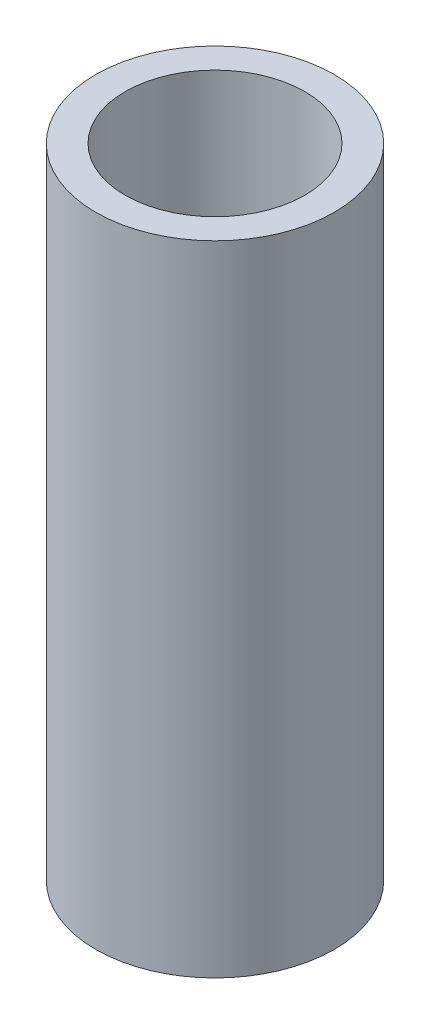
ISO-10303-21;
HEADER;
FILE_DESCRIPTION(('STEP AP214'),'2;1');
FILE_NAME('part.step','',(''),(''),'','','');
FILE_SCHEMA(('AUTOMOTIVE_DESIGN { 1 0 10303 214 1 1 1 1 }'));
ENDSEC;
DATA;
#1=APPLICATION_CONTEXT('core data for automotive mechanical design processes');
#2=APPLICATION_PROTOCOL_DEFINITION('international standard','automotive_design',2000,#1);
#3=PRODUCT_CONTEXT('',#1,'mechanical');
#4=PRODUCT('Part','Part','',(#3));
#5=PRODUCT_RELATED_PRODUCT_CATEGORY('part','',(#4));
#6=PRODUCT_DEFINITION_FORMATION('','',#4);
#7=PRODUCT_DEFINITION_CONTEXT('part definition',#1,'design');
#8=PRODUCT_DEFINITION('design','',#6,#7);
#9=PRODUCT_DEFINITION_SHAPE('','',#8);
#10=(LENGTH_UNIT() NAMED_UNIT(*) SI_UNIT(.MILLI.,.METRE.));
#11=(NAMED_UNIT(*) PLANE_ANGLE_UNIT() SI_UNIT($,.RADIAN.));
#12=(NAMED_UNIT(*) SI_UNIT($,.STERADIAN.) SOLID_ANGLE_UNIT());
#13=UNCERTAINTY_MEASURE_WITH_UNIT(LENGTH_MEASURE(1.E-05),#10,'distance_accuracy_value','');
#14=(GEOMETRIC_REPRESENTATION_CONTEXT(3) GLOBAL_UNCERTAINTY_ASSIGNED_CONTEXT((#13)) GLOBAL_UNIT_ASSIGNED_CONTEXT((#10,
#11,#12)) REPRESENTATION_CONTEXT('',''));
#15=CARTESIAN_POINT('',(0.,0.,0.));
#16=DIRECTION('',(0.,0.,1.));
#17=DIRECTION('',(1.,0.,0.));
#18=AXIS2_PLACEMENT_3D('',#15,#16,#17);
#19=CARTESIAN_POINT('',(0.,14.18,0.));
#20=DIRECTION('',(0.,1.,0.));
#21=DIRECTION('',(0.,0.,1.));
#22=AXIS2_PLACEMENT_3D('',#19,#20,#21);
#23=PLANE('',#22);
#24=CARTESIAN_POINT('',(0.,14.18,0.));
#25=DIRECTION('',(0.,1.,0.));
#26=DIRECTION('',(0.,0.,1.));
#27=AXIS2_PLACEMENT_3D('',#24,#25,#26);
#28=CIRCLE('',#27,2.65);
#29=CARTESIAN_POINT('',(0.,14.18,2.65));
#30=VERTEX_POINT('',#29);
#31=EDGE_CURVE('E10',#30,#30,#28,.T.);
#32=ORIENTED_EDGE('',*,*,#31,.T.);
#33=EDGE_LOOP('',(#32));
#34=FACE_BOUND('',#33,.T.);
#35=CARTESIAN_POINT('',(0.,14.18,0.));
#36=DIRECTION('',(0.,1.,0.));
#37=DIRECTION('',(0.,0.,1.));
#38=AXIS2_PLACEMENT_3D('',#35,#36,#37);
#39=CIRCLE('',#38,1.995);
#40=CARTESIAN_POINT('',(0.,14.18,1.995));
#41=VERTEX_POINT('',#40);
#42=EDGE_CURVE('E50',#41,#41,#39,.T.);
#43=ORIENTED_EDGE('',*,*,#42,.F.);
#44=EDGE_LOOP('',(#43));
#45=FACE_BOUND('',#44,.T.);
#46=ADVANCED_FACE('F37',(#34,#45),#23,.T.);
#47=CARTESIAN_POINT('',(0.,0.,0.));
#48=DIRECTION('',(0.,1.,0.));
#49=DIRECTION('',(0.,0.,1.));
#50=AXIS2_PLACEMENT_3D('',#47,#48,#49);
#51=PLANE('',#50);
#52=CARTESIAN_POINT('',(0.,0.,0.));
#53=DIRECTION('',(0.,1.,0.));
#54=DIRECTION('',(0.,0.,1.));
#55=AXIS2_PLACEMENT_3D('',#52,#53,#54);
#56=CIRCLE('',#55,2.65);
#57=CARTESIAN_POINT('',(0.,0.,2.65));
#58=VERTEX_POINT('',#57);
#59=EDGE_CURVE('E41',#58,#58,#56,.T.);
#60=ORIENTED_EDGE('',*,*,#59,.F.);
#61=EDGE_LOOP('',(#60));
#62=FACE_BOUND('',#61,.T.);
#63=CARTESIAN_POINT('',(0.,0.,0.));
#64=DIRECTION('',(0.,1.,0.));
#65=DIRECTION('',(0.,0.,1.));
#66=AXIS2_PLACEMENT_3D('',#63,#64,#65);
#67=CIRCLE('',#66,1.995);
#68=CARTESIAN_POINT('',(0.,0.,1.995));
#69=VERTEX_POINT('',#68);
#70=EDGE_CURVE('E52',#69,#69,#67,.T.);
#71=ORIENTED_EDGE('',*,*,#70,.T.);
#72=EDGE_LOOP('',(#71));
#73=FACE_BOUND('',#72,.T.);
#74=ADVANCED_FACE('F64',(#62,#73),#51,.F.);
#75=CARTESIAN_POINT('',(0.,14.18,0.));
#76=DIRECTION('',(0.,-1.,0.));
#77=DIRECTION('',(0.,0.,-1.));
#78=AXIS2_PLACEMENT_3D('',#75,#76,#77);
#79=CYLINDRICAL_SURFACE('',#78,2.65);
#80=ORIENTED_EDGE('',*,*,#31,.F.);
#81=EDGE_LOOP('',(#80));
#82=FACE_BOUND('',#81,.T.);
#83=ORIENTED_EDGE('',*,*,#59,.T.);
#84=EDGE_LOOP('',(#83));
#85=FACE_BOUND('',#84,.T.);
#86=ADVANCED_FACE('F39',(#82,#85),#79,.T.);
#87=CARTESIAN_POINT('',(0.,14.18,0.));
#88=DIRECTION('',(0.,-1.,0.));
#89=DIRECTION('',(0.,0.,-1.));
#90=AXIS2_PLACEMENT_3D('',#87,#88,#89);
#91=CYLINDRICAL_SURFACE('',#90,1.995);
#92=ORIENTED_EDGE('',*,*,#42,.T.);
#93=EDGE_LOOP('',(#92));
#94=FACE_BOUND('',#93,.T.);
#95=ORIENTED_EDGE('',*,*,#70,.F.);
#96=EDGE_LOOP('',(#95));
#97=FACE_BOUND('',#96,.T.);
#98=ADVANCED_FACE('F60',(#94,#97),#91,.F.);
#99=CLOSED_SHELL('',(#46,#74,#86,#98));
#100=MANIFOLD_SOLID_BREP('B2',#99);
#101=ADVANCED_BREP_SHAPE_REPRESENTATION('',(#18,#100),#14);
#102=SHAPE_DEFINITION_REPRESENTATION(#9,#101);
ENDSEC;
END-ISO-10303-21;
